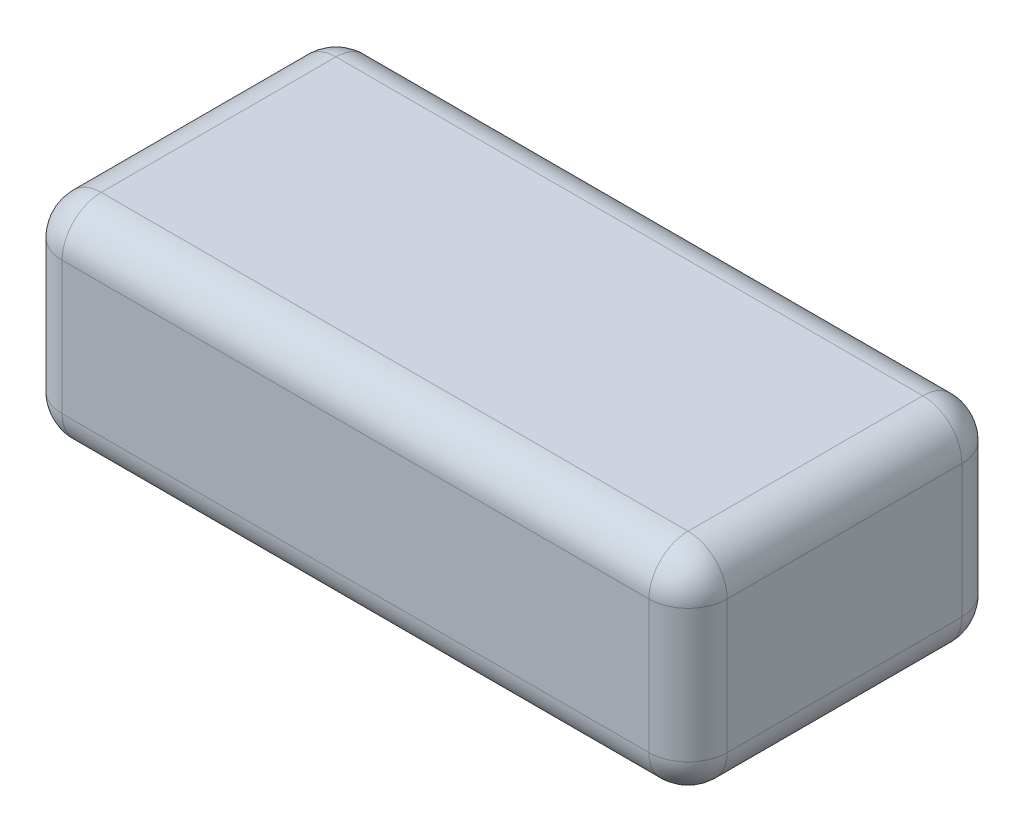
ISO-10303-21;
HEADER;
FILE_DESCRIPTION(('STEP AP214'),'2;1');
FILE_NAME('part.step','',(''),(''),'','','');
FILE_SCHEMA(('AUTOMOTIVE_DESIGN { 1 0 10303 214 1 1 1 1 }'));
ENDSEC;
DATA;
#1=APPLICATION_CONTEXT('core data for automotive mechanical design processes');
#2=APPLICATION_PROTOCOL_DEFINITION('international standard','automotive_design',2000,#1);
#3=PRODUCT_CONTEXT('',#1,'mechanical');
#4=PRODUCT('Part','Part','',(#3));
#5=PRODUCT_RELATED_PRODUCT_CATEGORY('part','',(#4));
#6=PRODUCT_DEFINITION_FORMATION('','',#4);
#7=PRODUCT_DEFINITION_CONTEXT('part definition',#1,'design');
#8=PRODUCT_DEFINITION('design','',#6,#7);
#9=PRODUCT_DEFINITION_SHAPE('','',#8);
#10=(LENGTH_UNIT() NAMED_UNIT(*) SI_UNIT(.MILLI.,.METRE.));
#11=(NAMED_UNIT(*) PLANE_ANGLE_UNIT() SI_UNIT($,.RADIAN.));
#12=(NAMED_UNIT(*) SI_UNIT($,.STERADIAN.) SOLID_ANGLE_UNIT());
#13=UNCERTAINTY_MEASURE_WITH_UNIT(LENGTH_MEASURE(1.E-05),#10,'distance_accuracy_value','');
#14=(GEOMETRIC_REPRESENTATION_CONTEXT(3) GLOBAL_UNCERTAINTY_ASSIGNED_CONTEXT((#13)) GLOBAL_UNIT_ASSIGNED_CONTEXT((#10,
#11,#12)) REPRESENTATION_CONTEXT('',''));
#15=CARTESIAN_POINT('',(0.,0.,0.));
#16=DIRECTION('',(0.,0.,1.));
#17=DIRECTION('',(1.,0.,0.));
#18=AXIS2_PLACEMENT_3D('',#15,#16,#17);
#19=CARTESIAN_POINT('',(-42.5,13.5,20.));
#20=DIRECTION('',(1.,0.,0.));
#21=DIRECTION('',(0.,0.,-1.));
#22=AXIS2_PLACEMENT_3D('',#19,#20,#21);
#23=PLANE('',#22);
#24=DIRECTION('',(0.,-1.,0.));
#25=VECTOR('',#24,1.);
#26=CARTESIAN_POINT('',(-42.5,13.5,-15.));
#27=LINE('',#26,#25);
#28=CARTESIAN_POINT('',(-42.5,8.5,-15.));
#29=VERTEX_POINT('',#28);
#30=CARTESIAN_POINT('',(-42.5,-8.5,-15.));
#31=VERTEX_POINT('',#30);
#32=EDGE_CURVE('E132',#29,#31,#27,.T.);
#33=ORIENTED_EDGE('',*,*,#32,.T.);
#34=DIRECTION('',(0.,0.,1.));
#35=VECTOR('',#34,1.);
#36=CARTESIAN_POINT('',(-42.5,-8.5,20.));
#37=LINE('',#36,#35);
#38=CARTESIAN_POINT('',(-42.5,-8.5,15.));
#39=VERTEX_POINT('',#38);
#40=EDGE_CURVE('E128',#31,#39,#37,.T.);
#41=ORIENTED_EDGE('',*,*,#40,.T.);
#42=DIRECTION('',(0.,-1.,0.));
#43=VECTOR('',#42,1.);
#44=CARTESIAN_POINT('',(-42.5,13.5,15.));
#45=LINE('',#44,#43);
#46=CARTESIAN_POINT('',(-42.5,8.5,15.));
#47=VERTEX_POINT('',#46);
#48=EDGE_CURVE('E123',#39,#47,#45,.F.);
#49=ORIENTED_EDGE('',*,*,#48,.T.);
#50=DIRECTION('',(0.,0.,1.));
#51=VECTOR('',#50,1.);
#52=CARTESIAN_POINT('',(-42.5,8.5,-20.));
#53=LINE('',#52,#51);
#54=EDGE_CURVE('E125',#47,#29,#53,.F.);
#55=ORIENTED_EDGE('',*,*,#54,.T.);
#56=EDGE_LOOP('',(#33,#41,#49,#55));
#57=FACE_BOUND('',#56,.T.);
#58=ADVANCED_FACE('F35',(#57),#23,.F.);
#59=CARTESIAN_POINT('',(42.5,13.5,20.));
#60=DIRECTION('',(0.,0.,-1.));
#61=DIRECTION('',(-1.,0.,0.));
#62=AXIS2_PLACEMENT_3D('',#59,#60,#61);
#63=PLANE('',#62);
#64=DIRECTION('',(0.,-1.,0.));
#65=VECTOR('',#64,1.);
#66=CARTESIAN_POINT('',(-37.5,13.5,20.));
#67=LINE('',#66,#65);
#68=CARTESIAN_POINT('',(-37.5,8.5,20.));
#69=VERTEX_POINT('',#68);
#70=CARTESIAN_POINT('',(-37.5,-8.5,20.));
#71=VERTEX_POINT('',#70);
#72=EDGE_CURVE('E154',#69,#71,#67,.T.);
#73=ORIENTED_EDGE('',*,*,#72,.T.);
#74=DIRECTION('',(1.,0.,0.));
#75=VECTOR('',#74,1.);
#76=CARTESIAN_POINT('',(42.5,-8.5,20.));
#77=LINE('',#76,#75);
#78=CARTESIAN_POINT('',(37.5,-8.5,20.));
#79=VERTEX_POINT('',#78);
#80=EDGE_CURVE('E232',#71,#79,#77,.T.);
#81=ORIENTED_EDGE('',*,*,#80,.T.);
#82=DIRECTION('',(0.,-1.,0.));
#83=VECTOR('',#82,1.);
#84=CARTESIAN_POINT('',(37.5,13.5,20.));
#85=LINE('',#84,#83);
#86=CARTESIAN_POINT('',(37.5,8.5,20.));
#87=VERTEX_POINT('',#86);
#88=EDGE_CURVE('E225',#79,#87,#85,.F.);
#89=ORIENTED_EDGE('',*,*,#88,.T.);
#90=DIRECTION('',(1.,0.,0.));
#91=VECTOR('',#90,1.);
#92=CARTESIAN_POINT('',(-42.5,8.5,20.));
#93=LINE('',#92,#91);
#94=EDGE_CURVE('E223',#87,#69,#93,.F.);
#95=ORIENTED_EDGE('',*,*,#94,.T.);
#96=EDGE_LOOP('',(#73,#81,#89,#95));
#97=FACE_BOUND('',#96,.T.);
#98=ADVANCED_FACE('F322',(#97),#63,.F.);
#99=CARTESIAN_POINT('',(42.5,13.5,20.));
#100=DIRECTION('',(-1.,0.,0.));
#101=DIRECTION('',(0.,0.,1.));
#102=AXIS2_PLACEMENT_3D('',#99,#100,#101);
#103=PLANE('',#102);
#104=DIRECTION('',(0.,0.,-1.));
#105=VECTOR('',#104,1.);
#106=CARTESIAN_POINT('',(42.5,-8.5,20.));
#107=LINE('',#106,#105);
#108=CARTESIAN_POINT('',(42.5,-8.5,15.));
#109=VERTEX_POINT('',#108);
#110=CARTESIAN_POINT('',(42.5,-8.5,-15.));
#111=VERTEX_POINT('',#110);
#112=EDGE_CURVE('E219',#109,#111,#107,.T.);
#113=ORIENTED_EDGE('',*,*,#112,.T.);
#114=DIRECTION('',(0.,-1.,0.));
#115=VECTOR('',#114,1.);
#116=CARTESIAN_POINT('',(42.5,13.5,-15.));
#117=LINE('',#116,#115);
#118=CARTESIAN_POINT('',(42.5,8.5,-15.));
#119=VERTEX_POINT('',#118);
#120=EDGE_CURVE('E216',#111,#119,#117,.F.);
#121=ORIENTED_EDGE('',*,*,#120,.T.);
#122=DIRECTION('',(0.,0.,-1.));
#123=VECTOR('',#122,1.);
#124=CARTESIAN_POINT('',(42.5,8.5,20.));
#125=LINE('',#124,#123);
#126=CARTESIAN_POINT('',(42.5,8.5,15.));
#127=VERTEX_POINT('',#126);
#128=EDGE_CURVE('E209',#119,#127,#125,.F.);
#129=ORIENTED_EDGE('',*,*,#128,.T.);
#130=DIRECTION('',(0.,-1.,0.));
#131=VECTOR('',#130,1.);
#132=CARTESIAN_POINT('',(42.5,13.5,15.));
#133=LINE('',#132,#131);
#134=EDGE_CURVE('E212',#127,#109,#133,.T.);
#135=ORIENTED_EDGE('',*,*,#134,.T.);
#136=EDGE_LOOP('',(#113,#121,#129,#135));
#137=FACE_BOUND('',#136,.T.);
#138=ADVANCED_FACE('F217',(#137),#103,.F.);
#139=CARTESIAN_POINT('',(42.5,13.5,-20.));
#140=DIRECTION('',(0.,0.,1.));
#141=DIRECTION('',(1.,0.,0.));
#142=AXIS2_PLACEMENT_3D('',#139,#140,#141);
#143=PLANE('',#142);
#144=DIRECTION('',(-1.,0.,0.));
#145=VECTOR('',#144,1.);
#146=CARTESIAN_POINT('',(42.5,-8.5,-20.));
#147=LINE('',#146,#145);
#148=CARTESIAN_POINT('',(37.5,-8.5,-20.));
#149=VERTEX_POINT('',#148);
#150=CARTESIAN_POINT('',(-37.5,-8.5,-20.));
#151=VERTEX_POINT('',#150);
#152=EDGE_CURVE('E281',#149,#151,#147,.T.);
#153=ORIENTED_EDGE('',*,*,#152,.T.);
#154=DIRECTION('',(0.,-1.,0.));
#155=VECTOR('',#154,1.);
#156=CARTESIAN_POINT('',(-37.5,13.5,-20.));
#157=LINE('',#156,#155);
#158=CARTESIAN_POINT('',(-37.5,8.5,-20.));
#159=VERTEX_POINT('',#158);
#160=EDGE_CURVE('E213',#151,#159,#157,.F.);
#161=ORIENTED_EDGE('',*,*,#160,.T.);
#162=DIRECTION('',(-1.,0.,0.));
#163=VECTOR('',#162,1.);
#164=CARTESIAN_POINT('',(42.5,8.5,-20.));
#165=LINE('',#164,#163);
#166=CARTESIAN_POINT('',(37.5,8.5,-20.));
#167=VERTEX_POINT('',#166);
#168=EDGE_CURVE('E274',#159,#167,#165,.F.);
#169=ORIENTED_EDGE('',*,*,#168,.T.);
#170=DIRECTION('',(0.,-1.,0.));
#171=VECTOR('',#170,1.);
#172=CARTESIAN_POINT('',(37.5,13.5,-20.));
#173=LINE('',#172,#171);
#174=EDGE_CURVE('E276',#167,#149,#173,.T.);
#175=ORIENTED_EDGE('',*,*,#174,.T.);
#176=EDGE_LOOP('',(#153,#161,#169,#175));
#177=FACE_BOUND('',#176,.T.);
#178=ADVANCED_FACE('F306',(#177),#143,.F.);
#179=CARTESIAN_POINT('',(0.,13.5,0.));
#180=DIRECTION('',(0.,1.,0.));
#181=DIRECTION('',(0.,0.,1.));
#182=AXIS2_PLACEMENT_3D('',#179,#180,#181);
#183=PLANE('',#182);
#184=DIRECTION('',(0.,0.,-1.));
#185=VECTOR('',#184,1.);
#186=CARTESIAN_POINT('',(37.5,13.5,-20.));
#187=LINE('',#186,#185);
#188=CARTESIAN_POINT('',(37.5,13.5,15.));
#189=VERTEX_POINT('',#188);
#190=CARTESIAN_POINT('',(37.5,13.5,-15.));
#191=VERTEX_POINT('',#190);
#192=EDGE_CURVE('E44',#189,#191,#187,.T.);
#193=ORIENTED_EDGE('',*,*,#192,.T.);
#194=DIRECTION('',(-1.,0.,0.));
#195=VECTOR('',#194,1.);
#196=CARTESIAN_POINT('',(-42.5,13.5,-15.));
#197=LINE('',#196,#195);
#198=CARTESIAN_POINT('',(-37.5,13.5,-15.));
#199=VERTEX_POINT('',#198);
#200=EDGE_CURVE('E11',#191,#199,#197,.T.);
#201=ORIENTED_EDGE('',*,*,#200,.T.);
#202=DIRECTION('',(0.,0.,1.));
#203=VECTOR('',#202,1.);
#204=CARTESIAN_POINT('',(-37.5,13.5,20.));
#205=LINE('',#204,#203);
#206=CARTESIAN_POINT('',(-37.5,13.5,15.));
#207=VERTEX_POINT('',#206);
#208=EDGE_CURVE('E234',#199,#207,#205,.T.);
#209=ORIENTED_EDGE('',*,*,#208,.T.);
#210=DIRECTION('',(1.,0.,0.));
#211=VECTOR('',#210,1.);
#212=CARTESIAN_POINT('',(42.5,13.5,15.));
#213=LINE('',#212,#211);
#214=EDGE_CURVE('E55',#207,#189,#213,.T.);
#215=ORIENTED_EDGE('',*,*,#214,.T.);
#216=EDGE_LOOP('',(#193,#201,#209,#215));
#217=FACE_BOUND('',#216,.T.);
#218=ADVANCED_FACE('F485',(#217),#183,.T.);
#219=CARTESIAN_POINT('',(0.,-13.5,0.));
#220=DIRECTION('',(0.,1.,0.));
#221=DIRECTION('',(0.,0.,1.));
#222=AXIS2_PLACEMENT_3D('',#219,#220,#221);
#223=PLANE('',#222);
#224=DIRECTION('',(1.,0.,0.));
#225=VECTOR('',#224,1.);
#226=CARTESIAN_POINT('',(0.,-13.5,15.));
#227=LINE('',#226,#225);
#228=CARTESIAN_POINT('',(37.5,-13.5,15.));
#229=VERTEX_POINT('',#228);
#230=CARTESIAN_POINT('',(-37.5,-13.5,15.));
#231=VERTEX_POINT('',#230);
#232=EDGE_CURVE('E270',#229,#231,#227,.F.);
#233=ORIENTED_EDGE('',*,*,#232,.T.);
#234=DIRECTION('',(0.,0.,1.));
#235=VECTOR('',#234,1.);
#236=CARTESIAN_POINT('',(-37.5,-13.5,0.));
#237=LINE('',#236,#235);
#238=CARTESIAN_POINT('',(-37.5,-13.5,-15.));
#239=VERTEX_POINT('',#238);
#240=EDGE_CURVE('E264',#231,#239,#237,.F.);
#241=ORIENTED_EDGE('',*,*,#240,.T.);
#242=DIRECTION('',(-1.,0.,0.));
#243=VECTOR('',#242,1.);
#244=CARTESIAN_POINT('',(0.,-13.5,-15.));
#245=LINE('',#244,#243);
#246=CARTESIAN_POINT('',(37.5,-13.5,-15.));
#247=VERTEX_POINT('',#246);
#248=EDGE_CURVE('E258',#239,#247,#245,.F.);
#249=ORIENTED_EDGE('',*,*,#248,.T.);
#250=DIRECTION('',(0.,0.,-1.));
#251=VECTOR('',#250,1.);
#252=CARTESIAN_POINT('',(37.5,-13.5,0.));
#253=LINE('',#252,#251);
#254=EDGE_CURVE('E265',#247,#229,#253,.F.);
#255=ORIENTED_EDGE('',*,*,#254,.T.);
#256=EDGE_LOOP('',(#233,#241,#249,#255));
#257=FACE_BOUND('',#256,.T.);
#258=ADVANCED_FACE('F268',(#257),#223,.F.);
#259=CARTESIAN_POINT('',(37.5,8.5,0.));
#260=DIRECTION('',(0.,0.,1.));
#261=DIRECTION('',(1.,0.,0.));
#262=AXIS2_PLACEMENT_3D('',#259,#260,#261);
#263=CYLINDRICAL_SURFACE('',#262,5.);
#264=CARTESIAN_POINT('',(37.5,8.5,-15.));
#265=DIRECTION('',(0.,0.,-1.));
#266=DIRECTION('',(-1.,0.,0.));
#267=AXIS2_PLACEMENT_3D('',#264,#265,#266);
#268=CIRCLE('',#267,5.);
#269=EDGE_CURVE('E39',#191,#119,#268,.T.);
#270=ORIENTED_EDGE('',*,*,#269,.F.);
#271=ORIENTED_EDGE('',*,*,#192,.F.);
#272=CARTESIAN_POINT('',(37.5,8.5,15.));
#273=DIRECTION('',(0.,0.,1.));
#274=DIRECTION('',(1.,0.,0.));
#275=AXIS2_PLACEMENT_3D('',#272,#273,#274);
#276=CIRCLE('',#275,5.);
#277=EDGE_CURVE('E194',#127,#189,#276,.T.);
#278=ORIENTED_EDGE('',*,*,#277,.F.);
#279=ORIENTED_EDGE('',*,*,#128,.F.);
#280=EDGE_LOOP('',(#270,#271,#278,#279));
#281=FACE_BOUND('',#280,.T.);
#282=ADVANCED_FACE('F37',(#281),#263,.T.);
#283=CARTESIAN_POINT('',(37.5,8.5,-15.));
#284=DIRECTION('',(0.,0.,1.));
#285=DIRECTION('',(1.,0.,0.));
#286=AXIS2_PLACEMENT_3D('',#283,#284,#285);
#287=SPHERICAL_SURFACE('',#286,5.);
#288=CARTESIAN_POINT('',(37.5,8.5,-15.));
#289=DIRECTION('',(1.,0.,0.));
#290=DIRECTION('',(0.,0.,-1.));
#291=AXIS2_PLACEMENT_3D('',#288,#289,#290);
#292=CIRCLE('',#291,5.);
#293=EDGE_CURVE('E190',#191,#167,#292,.F.);
#294=ORIENTED_EDGE('',*,*,#293,.F.);
#295=ORIENTED_EDGE('',*,*,#269,.T.);
#296=CARTESIAN_POINT('',(37.5,8.5,-15.));
#297=DIRECTION('',(0.,1.,0.));
#298=DIRECTION('',(0.,0.,1.));
#299=AXIS2_PLACEMENT_3D('',#296,#297,#298);
#300=CIRCLE('',#299,5.);
#301=EDGE_CURVE('E193',#167,#119,#300,.F.);
#302=ORIENTED_EDGE('',*,*,#301,.F.);
#303=EDGE_LOOP('',(#294,#295,#302));
#304=FACE_BOUND('',#303,.T.);
#305=ADVANCED_FACE('F205',(#304),#287,.T.);
#306=CARTESIAN_POINT('',(37.5,8.5,15.));
#307=DIRECTION('',(0.,0.,1.));
#308=DIRECTION('',(1.,0.,0.));
#309=AXIS2_PLACEMENT_3D('',#306,#307,#308);
#310=SPHERICAL_SURFACE('',#309,5.);
#311=CARTESIAN_POINT('',(37.5,8.5,15.));
#312=DIRECTION('',(0.,1.,0.));
#313=DIRECTION('',(0.,0.,1.));
#314=AXIS2_PLACEMENT_3D('',#311,#312,#313);
#315=CIRCLE('',#314,5.);
#316=EDGE_CURVE('E184',#127,#87,#315,.F.);
#317=ORIENTED_EDGE('',*,*,#316,.F.);
#318=ORIENTED_EDGE('',*,*,#277,.T.);
#319=CARTESIAN_POINT('',(37.5,8.5,15.));
#320=DIRECTION('',(1.,0.,0.));
#321=DIRECTION('',(0.,0.,-1.));
#322=AXIS2_PLACEMENT_3D('',#319,#320,#321);
#323=CIRCLE('',#322,5.);
#324=EDGE_CURVE('E187',#87,#189,#323,.F.);
#325=ORIENTED_EDGE('',*,*,#324,.F.);
#326=EDGE_LOOP('',(#317,#318,#325));
#327=FACE_BOUND('',#326,.T.);
#328=ADVANCED_FACE('F458',(#327),#310,.T.);
#329=CARTESIAN_POINT('',(37.5,13.5,-15.));
#330=DIRECTION('',(0.,-1.,0.));
#331=DIRECTION('',(0.,0.,-1.));
#332=AXIS2_PLACEMENT_3D('',#329,#330,#331);
#333=CYLINDRICAL_SURFACE('',#332,5.);
#334=ORIENTED_EDGE('',*,*,#301,.T.);
#335=ORIENTED_EDGE('',*,*,#120,.F.);
#336=CARTESIAN_POINT('',(37.5,-8.5,-15.));
#337=DIRECTION('',(0.,-1.,0.));
#338=DIRECTION('',(0.,0.,-1.));
#339=AXIS2_PLACEMENT_3D('',#336,#337,#338);
#340=CIRCLE('',#339,5.);
#341=EDGE_CURVE('E178',#149,#111,#340,.T.);
#342=ORIENTED_EDGE('',*,*,#341,.F.);
#343=ORIENTED_EDGE('',*,*,#174,.F.);
#344=EDGE_LOOP('',(#334,#335,#342,#343));
#345=FACE_BOUND('',#344,.T.);
#346=ADVANCED_FACE('F308',(#345),#333,.T.);
#347=CARTESIAN_POINT('',(0.,8.5,-15.));
#348=DIRECTION('',(1.,0.,0.));
#349=DIRECTION('',(0.,0.,-1.));
#350=AXIS2_PLACEMENT_3D('',#347,#348,#349);
#351=CYLINDRICAL_SURFACE('',#350,5.);
#352=ORIENTED_EDGE('',*,*,#293,.T.);
#353=ORIENTED_EDGE('',*,*,#168,.F.);
#354=CARTESIAN_POINT('',(-37.5,8.5,-15.));
#355=DIRECTION('',(-1.,0.,0.));
#356=DIRECTION('',(0.,0.,1.));
#357=AXIS2_PLACEMENT_3D('',#354,#355,#356);
#358=CIRCLE('',#357,5.);
#359=EDGE_CURVE('E175',#199,#159,#358,.T.);
#360=ORIENTED_EDGE('',*,*,#359,.F.);
#361=ORIENTED_EDGE('',*,*,#200,.F.);
#362=EDGE_LOOP('',(#352,#353,#360,#361));
#363=FACE_BOUND('',#362,.T.);
#364=ADVANCED_FACE('F442',(#363),#351,.T.);
#365=CARTESIAN_POINT('',(-37.5,8.5,0.));
#366=DIRECTION('',(0.,0.,-1.));
#367=DIRECTION('',(-1.,0.,0.));
#368=AXIS2_PLACEMENT_3D('',#365,#366,#367);
#369=CYLINDRICAL_SURFACE('',#368,5.);
#370=CARTESIAN_POINT('',(-37.5,8.5,15.));
#371=DIRECTION('',(0.,0.,1.));
#372=DIRECTION('',(1.,0.,0.));
#373=AXIS2_PLACEMENT_3D('',#370,#371,#372);
#374=CIRCLE('',#373,5.);
#375=EDGE_CURVE('E139',#207,#47,#374,.T.);
#376=ORIENTED_EDGE('',*,*,#375,.F.);
#377=ORIENTED_EDGE('',*,*,#208,.F.);
#378=CARTESIAN_POINT('',(-37.5,8.5,-15.));
#379=DIRECTION('',(0.,0.,-1.));
#380=DIRECTION('',(0.,1.,0.));
#381=AXIS2_PLACEMENT_3D('',#378,#379,#380);
#382=CIRCLE('',#381,5.);
#383=EDGE_CURVE('E141',#29,#199,#382,.T.);
#384=ORIENTED_EDGE('',*,*,#383,.F.);
#385=ORIENTED_EDGE('',*,*,#54,.F.);
#386=EDGE_LOOP('',(#376,#377,#384,#385));
#387=FACE_BOUND('',#386,.T.);
#388=ADVANCED_FACE('F137',(#387),#369,.T.);
#389=CARTESIAN_POINT('',(0.,8.5,15.));
#390=DIRECTION('',(-1.,0.,0.));
#391=DIRECTION('',(0.,0.,1.));
#392=AXIS2_PLACEMENT_3D('',#389,#390,#391);
#393=CYLINDRICAL_SURFACE('',#392,5.);
#394=ORIENTED_EDGE('',*,*,#324,.T.);
#395=ORIENTED_EDGE('',*,*,#214,.F.);
#396=CARTESIAN_POINT('',(-37.5,8.5,15.));
#397=DIRECTION('',(-1.,0.,0.));
#398=DIRECTION('',(0.,-1.,0.));
#399=AXIS2_PLACEMENT_3D('',#396,#397,#398);
#400=CIRCLE('',#399,5.);
#401=EDGE_CURVE('E150',#69,#207,#400,.T.);
#402=ORIENTED_EDGE('',*,*,#401,.F.);
#403=ORIENTED_EDGE('',*,*,#94,.F.);
#404=EDGE_LOOP('',(#394,#395,#402,#403));
#405=FACE_BOUND('',#404,.T.);
#406=ADVANCED_FACE('F426',(#405),#393,.T.);
#407=CARTESIAN_POINT('',(37.5,13.5,15.));
#408=DIRECTION('',(0.,-1.,0.));
#409=DIRECTION('',(0.,0.,-1.));
#410=AXIS2_PLACEMENT_3D('',#407,#408,#409);
#411=CYLINDRICAL_SURFACE('',#410,5.);
#412=ORIENTED_EDGE('',*,*,#316,.T.);
#413=ORIENTED_EDGE('',*,*,#88,.F.);
#414=CARTESIAN_POINT('',(37.5,-8.5,15.));
#415=DIRECTION('',(0.,-1.,0.));
#416=DIRECTION('',(0.,0.,-1.));
#417=AXIS2_PLACEMENT_3D('',#414,#415,#416);
#418=CIRCLE('',#417,5.);
#419=EDGE_CURVE('E170',#109,#79,#418,.T.);
#420=ORIENTED_EDGE('',*,*,#419,.F.);
#421=ORIENTED_EDGE('',*,*,#134,.F.);
#422=EDGE_LOOP('',(#412,#413,#420,#421));
#423=FACE_BOUND('',#422,.T.);
#424=ADVANCED_FACE('F292',(#423),#411,.T.);
#425=CARTESIAN_POINT('',(37.5,-8.5,20.));
#426=DIRECTION('',(0.,0.,-1.));
#427=DIRECTION('',(-1.,0.,0.));
#428=AXIS2_PLACEMENT_3D('',#425,#426,#427);
#429=CYLINDRICAL_SURFACE('',#428,5.);
#430=CARTESIAN_POINT('',(37.5,-8.5,-15.));
#431=DIRECTION('',(0.,0.,-1.));
#432=DIRECTION('',(-1.,0.,0.));
#433=AXIS2_PLACEMENT_3D('',#430,#431,#432);
#434=CIRCLE('',#433,5.);
#435=EDGE_CURVE('E181',#111,#247,#434,.T.);
#436=ORIENTED_EDGE('',*,*,#435,.F.);
#437=ORIENTED_EDGE('',*,*,#112,.F.);
#438=CARTESIAN_POINT('',(37.5,-8.5,15.));
#439=DIRECTION('',(0.,0.,1.));
#440=DIRECTION('',(1.,0.,0.));
#441=AXIS2_PLACEMENT_3D('',#438,#439,#440);
#442=CIRCLE('',#441,5.);
#443=EDGE_CURVE('E167',#229,#109,#442,.T.);
#444=ORIENTED_EDGE('',*,*,#443,.F.);
#445=ORIENTED_EDGE('',*,*,#254,.F.);
#446=EDGE_LOOP('',(#436,#437,#444,#445));
#447=FACE_BOUND('',#446,.T.);
#448=ADVANCED_FACE('F289',(#447),#429,.T.);
#449=CARTESIAN_POINT('',(37.5,-8.5,-15.));
#450=DIRECTION('',(0.,0.,1.));
#451=DIRECTION('',(1.,0.,0.));
#452=AXIS2_PLACEMENT_3D('',#449,#450,#451);
#453=SPHERICAL_SURFACE('',#452,5.);
#454=ORIENTED_EDGE('',*,*,#341,.T.);
#455=ORIENTED_EDGE('',*,*,#435,.T.);
#456=CARTESIAN_POINT('',(37.5,-8.5,-15.));
#457=DIRECTION('',(1.,0.,0.));
#458=DIRECTION('',(0.,0.,-1.));
#459=AXIS2_PLACEMENT_3D('',#456,#457,#458);
#460=CIRCLE('',#459,5.);
#461=EDGE_CURVE('E158',#149,#247,#460,.F.);
#462=ORIENTED_EDGE('',*,*,#461,.F.);
#463=EDGE_LOOP('',(#454,#455,#462));
#464=FACE_BOUND('',#463,.T.);
#465=ADVANCED_FACE('F310',(#464),#453,.T.);
#466=CARTESIAN_POINT('',(-37.5,8.5,-15.));
#467=DIRECTION('',(0.,0.,1.));
#468=DIRECTION('',(1.,0.,0.));
#469=AXIS2_PLACEMENT_3D('',#466,#467,#468);
#470=SPHERICAL_SURFACE('',#469,5.);
#471=ORIENTED_EDGE('',*,*,#383,.T.);
#472=ORIENTED_EDGE('',*,*,#359,.T.);
#473=CARTESIAN_POINT('',(-37.5,8.5,-15.));
#474=DIRECTION('',(0.,1.,0.));
#475=DIRECTION('',(0.,0.,1.));
#476=AXIS2_PLACEMENT_3D('',#473,#474,#475);
#477=CIRCLE('',#476,5.);
#478=EDGE_CURVE('E155',#29,#159,#477,.F.);
#479=ORIENTED_EDGE('',*,*,#478,.F.);
#480=EDGE_LOOP('',(#471,#472,#479));
#481=FACE_BOUND('',#480,.T.);
#482=ADVANCED_FACE('F312',(#481),#470,.T.);
#483=CARTESIAN_POINT('',(-37.5,8.5,15.));
#484=DIRECTION('',(0.,0.,1.));
#485=DIRECTION('',(1.,0.,0.));
#486=AXIS2_PLACEMENT_3D('',#483,#484,#485);
#487=SPHERICAL_SURFACE('',#486,5.);
#488=ORIENTED_EDGE('',*,*,#401,.T.);
#489=ORIENTED_EDGE('',*,*,#375,.T.);
#490=CARTESIAN_POINT('',(-37.5,8.5,15.));
#491=DIRECTION('',(0.,1.,0.));
#492=DIRECTION('',(0.,0.,1.));
#493=AXIS2_PLACEMENT_3D('',#490,#491,#492);
#494=CIRCLE('',#493,5.);
#495=EDGE_CURVE('E147',#69,#47,#494,.F.);
#496=ORIENTED_EDGE('',*,*,#495,.F.);
#497=EDGE_LOOP('',(#488,#489,#496));
#498=FACE_BOUND('',#497,.T.);
#499=ADVANCED_FACE('F146',(#498),#487,.T.);
#500=CARTESIAN_POINT('',(37.5,-8.5,15.));
#501=DIRECTION('',(0.,0.,1.));
#502=DIRECTION('',(1.,0.,0.));
#503=AXIS2_PLACEMENT_3D('',#500,#501,#502);
#504=SPHERICAL_SURFACE('',#503,5.);
#505=ORIENTED_EDGE('',*,*,#443,.T.);
#506=ORIENTED_EDGE('',*,*,#419,.T.);
#507=CARTESIAN_POINT('',(37.5,-8.5,15.));
#508=DIRECTION('',(1.,0.,0.));
#509=DIRECTION('',(0.,0.,-1.));
#510=AXIS2_PLACEMENT_3D('',#507,#508,#509);
#511=CIRCLE('',#510,5.);
#512=EDGE_CURVE('E156',#229,#79,#511,.F.);
#513=ORIENTED_EDGE('',*,*,#512,.F.);
#514=EDGE_LOOP('',(#505,#506,#513));
#515=FACE_BOUND('',#514,.T.);
#516=ADVANCED_FACE('F294',(#515),#504,.T.);
#517=CARTESIAN_POINT('',(42.5,-8.5,-15.));
#518=DIRECTION('',(-1.,0.,0.));
#519=DIRECTION('',(0.,0.,1.));
#520=AXIS2_PLACEMENT_3D('',#517,#518,#519);
#521=CYLINDRICAL_SURFACE('',#520,5.);
#522=ORIENTED_EDGE('',*,*,#461,.T.);
#523=ORIENTED_EDGE('',*,*,#248,.F.);
#524=CARTESIAN_POINT('',(-37.5,-8.5,-15.));
#525=DIRECTION('',(-1.,0.,0.));
#526=DIRECTION('',(0.,0.,1.));
#527=AXIS2_PLACEMENT_3D('',#524,#525,#526);
#528=CIRCLE('',#527,5.);
#529=EDGE_CURVE('E161',#151,#239,#528,.T.);
#530=ORIENTED_EDGE('',*,*,#529,.F.);
#531=ORIENTED_EDGE('',*,*,#152,.F.);
#532=EDGE_LOOP('',(#522,#523,#530,#531));
#533=FACE_BOUND('',#532,.T.);
#534=ADVANCED_FACE('F260',(#533),#521,.T.);
#535=CARTESIAN_POINT('',(-37.5,13.5,-15.));
#536=DIRECTION('',(0.,-1.,0.));
#537=DIRECTION('',(0.,0.,-1.));
#538=AXIS2_PLACEMENT_3D('',#535,#536,#537);
#539=CYLINDRICAL_SURFACE('',#538,5.);
#540=ORIENTED_EDGE('',*,*,#478,.T.);
#541=ORIENTED_EDGE('',*,*,#160,.F.);
#542=CARTESIAN_POINT('',(-37.5,-8.5,-15.));
#543=DIRECTION('',(0.,-1.,0.));
#544=DIRECTION('',(0.,0.,-1.));
#545=AXIS2_PLACEMENT_3D('',#542,#543,#544);
#546=CIRCLE('',#545,5.);
#547=EDGE_CURVE('E247',#31,#151,#546,.T.);
#548=ORIENTED_EDGE('',*,*,#547,.F.);
#549=ORIENTED_EDGE('',*,*,#32,.F.);
#550=EDGE_LOOP('',(#540,#541,#548,#549));
#551=FACE_BOUND('',#550,.T.);
#552=ADVANCED_FACE('F304',(#551),#539,.T.);
#553=CARTESIAN_POINT('',(-37.5,13.5,15.));
#554=DIRECTION('',(0.,-1.,0.));
#555=DIRECTION('',(0.,0.,-1.));
#556=AXIS2_PLACEMENT_3D('',#553,#554,#555);
#557=CYLINDRICAL_SURFACE('',#556,5.);
#558=ORIENTED_EDGE('',*,*,#495,.T.);
#559=ORIENTED_EDGE('',*,*,#48,.F.);
#560=CARTESIAN_POINT('',(-37.5,-8.5,15.));
#561=DIRECTION('',(0.,-1.,0.));
#562=DIRECTION('',(0.,0.,-1.));
#563=AXIS2_PLACEMENT_3D('',#560,#561,#562);
#564=CIRCLE('',#563,5.);
#565=EDGE_CURVE('E244',#71,#39,#564,.T.);
#566=ORIENTED_EDGE('',*,*,#565,.F.);
#567=ORIENTED_EDGE('',*,*,#72,.F.);
#568=EDGE_LOOP('',(#558,#559,#566,#567));
#569=FACE_BOUND('',#568,.T.);
#570=ADVANCED_FACE('F152',(#569),#557,.T.);
#571=CARTESIAN_POINT('',(42.5,-8.5,15.));
#572=DIRECTION('',(1.,0.,0.));
#573=DIRECTION('',(0.,0.,-1.));
#574=AXIS2_PLACEMENT_3D('',#571,#572,#573);
#575=CYLINDRICAL_SURFACE('',#574,5.);
#576=ORIENTED_EDGE('',*,*,#512,.T.);
#577=ORIENTED_EDGE('',*,*,#80,.F.);
#578=CARTESIAN_POINT('',(-37.5,-8.5,15.));
#579=DIRECTION('',(-1.,0.,0.));
#580=DIRECTION('',(0.,0.,1.));
#581=AXIS2_PLACEMENT_3D('',#578,#579,#580);
#582=CIRCLE('',#581,5.);
#583=EDGE_CURVE('E242',#231,#71,#582,.T.);
#584=ORIENTED_EDGE('',*,*,#583,.F.);
#585=ORIENTED_EDGE('',*,*,#232,.F.);
#586=EDGE_LOOP('',(#576,#577,#584,#585));
#587=FACE_BOUND('',#586,.T.);
#588=ADVANCED_FACE('F297',(#587),#575,.T.);
#589=CARTESIAN_POINT('',(-37.5,-8.5,-15.));
#590=DIRECTION('',(0.,0.,1.));
#591=DIRECTION('',(1.,0.,0.));
#592=AXIS2_PLACEMENT_3D('',#589,#590,#591);
#593=SPHERICAL_SURFACE('',#592,5.);
#594=ORIENTED_EDGE('',*,*,#547,.T.);
#595=ORIENTED_EDGE('',*,*,#529,.T.);
#596=CARTESIAN_POINT('',(-37.5,-8.5,-15.));
#597=DIRECTION('',(0.,0.,-1.));
#598=DIRECTION('',(-1.,0.,0.));
#599=AXIS2_PLACEMENT_3D('',#596,#597,#598);
#600=CIRCLE('',#599,5.);
#601=EDGE_CURVE('E240',#31,#239,#600,.F.);
#602=ORIENTED_EDGE('',*,*,#601,.F.);
#603=EDGE_LOOP('',(#594,#595,#602));
#604=FACE_BOUND('',#603,.T.);
#605=ADVANCED_FACE('F254',(#604),#593,.T.);
#606=CARTESIAN_POINT('',(-37.5,-8.5,15.));
#607=DIRECTION('',(0.,0.,1.));
#608=DIRECTION('',(1.,0.,0.));
#609=AXIS2_PLACEMENT_3D('',#606,#607,#608);
#610=SPHERICAL_SURFACE('',#609,5.);
#611=ORIENTED_EDGE('',*,*,#583,.T.);
#612=ORIENTED_EDGE('',*,*,#565,.T.);
#613=CARTESIAN_POINT('',(-37.5,-8.5,15.));
#614=DIRECTION('',(0.,0.,1.));
#615=DIRECTION('',(1.,0.,0.));
#616=AXIS2_PLACEMENT_3D('',#613,#614,#615);
#617=CIRCLE('',#616,5.);
#618=EDGE_CURVE('E238',#231,#39,#617,.F.);
#619=ORIENTED_EDGE('',*,*,#618,.F.);
#620=EDGE_LOOP('',(#611,#612,#619));
#621=FACE_BOUND('',#620,.T.);
#622=ADVANCED_FACE('F334',(#621),#610,.T.);
#623=CARTESIAN_POINT('',(-37.5,-8.5,20.));
#624=DIRECTION('',(0.,0.,1.));
#625=DIRECTION('',(1.,0.,0.));
#626=AXIS2_PLACEMENT_3D('',#623,#624,#625);
#627=CYLINDRICAL_SURFACE('',#626,5.);
#628=ORIENTED_EDGE('',*,*,#601,.T.);
#629=ORIENTED_EDGE('',*,*,#240,.F.);
#630=ORIENTED_EDGE('',*,*,#618,.T.);
#631=ORIENTED_EDGE('',*,*,#40,.F.);
#632=EDGE_LOOP('',(#628,#629,#630,#631));
#633=FACE_BOUND('',#632,.T.);
#634=ADVANCED_FACE('F331',(#633),#627,.T.);
#635=CLOSED_SHELL('',(#58,#98,#138,#178,#218,#258,#282,#305,#328,#346,#364,#388,#406,#424,#448,
#465,#482,#499,#516,#534,#552,#570,#588,#605,#622,#634));
#636=MANIFOLD_SOLID_BREP('B2',#635);
#637=ADVANCED_BREP_SHAPE_REPRESENTATION('',(#18,#636),#14);
#638=SHAPE_DEFINITION_REPRESENTATION(#9,#637);
ENDSEC;
END-ISO-10303-21;
